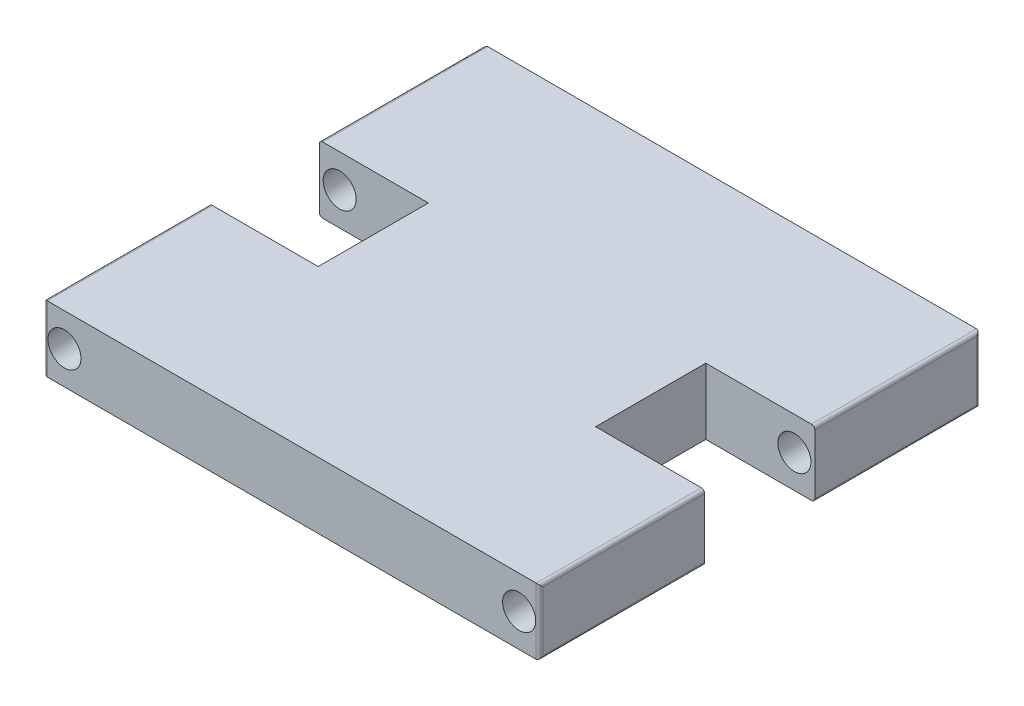
ISO-10303-21;
HEADER;
FILE_DESCRIPTION(('STEP AP214'),'2;1');
FILE_NAME('part.step','',(''),(''),'','','');
FILE_SCHEMA(('AUTOMOTIVE_DESIGN { 1 0 10303 214 1 1 1 1 }'));
ENDSEC;
DATA;
#1=APPLICATION_CONTEXT('core data for automotive mechanical design processes');
#2=APPLICATION_PROTOCOL_DEFINITION('international standard','automotive_design',2000,#1);
#3=PRODUCT_CONTEXT('',#1,'mechanical');
#4=PRODUCT('Part','Part','',(#3));
#5=PRODUCT_RELATED_PRODUCT_CATEGORY('part','',(#4));
#6=PRODUCT_DEFINITION_FORMATION('','',#4);
#7=PRODUCT_DEFINITION_CONTEXT('part definition',#1,'design');
#8=PRODUCT_DEFINITION('design','',#6,#7);
#9=PRODUCT_DEFINITION_SHAPE('','',#8);
#10=(LENGTH_UNIT() NAMED_UNIT(*) SI_UNIT(.MILLI.,.METRE.));
#11=(NAMED_UNIT(*) PLANE_ANGLE_UNIT() SI_UNIT($,.RADIAN.));
#12=(NAMED_UNIT(*) SI_UNIT($,.STERADIAN.) SOLID_ANGLE_UNIT());
#13=UNCERTAINTY_MEASURE_WITH_UNIT(LENGTH_MEASURE(1.E-05),#10,'distance_accuracy_value','');
#14=(GEOMETRIC_REPRESENTATION_CONTEXT(3) GLOBAL_UNCERTAINTY_ASSIGNED_CONTEXT((#13)) GLOBAL_UNIT_ASSIGNED_CONTEXT((#10,
#11,#12)) REPRESENTATION_CONTEXT('',''));
#15=CARTESIAN_POINT('',(0.,0.,0.));
#16=DIRECTION('',(0.,0.,1.));
#17=DIRECTION('',(1.,0.,0.));
#18=AXIS2_PLACEMENT_3D('',#15,#16,#17);
#19=CARTESIAN_POINT('',(0.,60.,-3.00000000000002));
#20=DIRECTION('',(1.,0.,0.));
#21=DIRECTION('',(0.,0.,-1.));
#22=AXIS2_PLACEMENT_3D('',#19,#20,#21);
#23=PLANE('',#22);
#24=DIRECTION('',(0.,1.,0.));
#25=VECTOR('',#24,1.);
#26=CARTESIAN_POINT('',(0.,60.,-150.));
#27=LINE('',#26,#25);
#28=CARTESIAN_POINT('',(0.,3.,-150.));
#29=VERTEX_POINT('',#28);
#30=CARTESIAN_POINT('',(0.,56.9999999999999,-150.));
#31=VERTEX_POINT('',#30);
#32=EDGE_CURVE('E280',#29,#31,#27,.T.);
#33=ORIENTED_EDGE('',*,*,#32,.F.);
#34=DIRECTION('',(0.,0.,1.));
#35=VECTOR('',#34,1.);
#36=CARTESIAN_POINT('',(0.,3.00000000000002,-400.));
#37=LINE('',#36,#35);
#38=CARTESIAN_POINT('',(0.,3.00000000000002,-3.));
#39=VERTEX_POINT('',#38);
#40=EDGE_CURVE('E297',#29,#39,#37,.T.);
#41=ORIENTED_EDGE('',*,*,#40,.T.);
#42=DIRECTION('',(0.,-1.,0.));
#43=VECTOR('',#42,1.);
#44=CARTESIAN_POINT('',(0.,60.,-3.00000000000002));
#45=LINE('',#44,#43);
#46=CARTESIAN_POINT('',(0.,56.9999999999999,-3.));
#47=VERTEX_POINT('',#46);
#48=EDGE_CURVE('E436',#47,#39,#45,.T.);
#49=ORIENTED_EDGE('',*,*,#48,.F.);
#50=DIRECTION('',(0.,0.,1.));
#51=VECTOR('',#50,1.);
#52=CARTESIAN_POINT('',(0.,56.9999999999999,-400.));
#53=LINE('',#52,#51);
#54=EDGE_CURVE('E298',#31,#47,#53,.T.);
#55=ORIENTED_EDGE('',*,*,#54,.F.);
#56=EDGE_LOOP('',(#33,#41,#49,#55));
#57=FACE_BOUND('',#56,.T.);
#58=ADVANCED_FACE('F40',(#57),#23,.F.);
#59=DIRECTION('',(0.,-1.,0.));
#60=VECTOR('',#59,1.);
#61=CARTESIAN_POINT('',(0.,60.,-250.));
#62=LINE('',#61,#60);
#63=CARTESIAN_POINT('',(0.,56.9999999999999,-250.));
#64=VERTEX_POINT('',#63);
#65=CARTESIAN_POINT('',(0.,3.,-250.));
#66=VERTEX_POINT('',#65);
#67=EDGE_CURVE('E266',#64,#66,#62,.T.);
#68=ORIENTED_EDGE('',*,*,#67,.F.);
#69=CARTESIAN_POINT('',(0.,56.9999999999999,-397.));
#70=VERTEX_POINT('',#69);
#71=EDGE_CURVE('E293',#70,#64,#53,.T.);
#72=ORIENTED_EDGE('',*,*,#71,.F.);
#73=DIRECTION('',(0.,-1.,0.));
#74=VECTOR('',#73,1.);
#75=CARTESIAN_POINT('',(0.,60.,-397.));
#76=LINE('',#75,#74);
#77=CARTESIAN_POINT('',(0.,3.00000000000002,-397.));
#78=VERTEX_POINT('',#77);
#79=EDGE_CURVE('E440',#70,#78,#76,.T.);
#80=ORIENTED_EDGE('',*,*,#79,.T.);
#81=EDGE_CURVE('E299',#78,#66,#37,.T.);
#82=ORIENTED_EDGE('',*,*,#81,.T.);
#83=EDGE_LOOP('',(#68,#72,#80,#82));
#84=FACE_BOUND('',#83,.T.);
#85=ADVANCED_FACE('F486',(#84),#23,.F.);
#86=CARTESIAN_POINT('',(450.,60.,-3.));
#87=DIRECTION('',(-1.,0.,0.));
#88=DIRECTION('',(0.,0.,1.));
#89=AXIS2_PLACEMENT_3D('',#86,#87,#88);
#90=PLANE('',#89);
#91=DIRECTION('',(0.,-1.,0.));
#92=VECTOR('',#91,1.);
#93=CARTESIAN_POINT('',(450.,60.,-150.));
#94=LINE('',#93,#92);
#95=CARTESIAN_POINT('',(450.,57.,-150.));
#96=VERTEX_POINT('',#95);
#97=CARTESIAN_POINT('',(450.,3.,-150.));
#98=VERTEX_POINT('',#97);
#99=EDGE_CURVE('E253',#96,#98,#94,.T.);
#100=ORIENTED_EDGE('',*,*,#99,.F.);
#101=DIRECTION('',(0.,0.,1.));
#102=VECTOR('',#101,1.);
#103=CARTESIAN_POINT('',(450.,57.,-400.));
#104=LINE('',#103,#102);
#105=CARTESIAN_POINT('',(450.,57.,-3.));
#106=VERTEX_POINT('',#105);
#107=EDGE_CURVE('E400',#96,#106,#104,.T.);
#108=ORIENTED_EDGE('',*,*,#107,.T.);
#109=DIRECTION('',(0.,-1.,0.));
#110=VECTOR('',#109,1.);
#111=CARTESIAN_POINT('',(450.,60.,-3.));
#112=LINE('',#111,#110);
#113=CARTESIAN_POINT('',(450.,3.,-3.));
#114=VERTEX_POINT('',#113);
#115=EDGE_CURVE('E429',#106,#114,#112,.T.);
#116=ORIENTED_EDGE('',*,*,#115,.T.);
#117=DIRECTION('',(0.,0.,1.));
#118=VECTOR('',#117,1.);
#119=CARTESIAN_POINT('',(450.,3.,-400.));
#120=LINE('',#119,#118);
#121=EDGE_CURVE('E410',#98,#114,#120,.T.);
#122=ORIENTED_EDGE('',*,*,#121,.F.);
#123=EDGE_LOOP('',(#100,#108,#116,#122));
#124=FACE_BOUND('',#123,.T.);
#125=ADVANCED_FACE('F492',(#124),#90,.F.);
#126=DIRECTION('',(0.,1.,0.));
#127=VECTOR('',#126,1.);
#128=CARTESIAN_POINT('',(450.,60.,-250.));
#129=LINE('',#128,#127);
#130=CARTESIAN_POINT('',(450.,3.,-250.));
#131=VERTEX_POINT('',#130);
#132=CARTESIAN_POINT('',(450.,57.,-250.));
#133=VERTEX_POINT('',#132);
#134=EDGE_CURVE('E67',#131,#133,#129,.T.);
#135=ORIENTED_EDGE('',*,*,#134,.F.);
#136=CARTESIAN_POINT('',(450.,3.,-397.));
#137=VERTEX_POINT('',#136);
#138=EDGE_CURVE('E305',#137,#131,#120,.T.);
#139=ORIENTED_EDGE('',*,*,#138,.F.);
#140=DIRECTION('',(0.,-1.,0.));
#141=VECTOR('',#140,1.);
#142=CARTESIAN_POINT('',(450.,60.,-397.));
#143=LINE('',#142,#141);
#144=CARTESIAN_POINT('',(450.,57.,-397.));
#145=VERTEX_POINT('',#144);
#146=EDGE_CURVE('E332',#145,#137,#143,.T.);
#147=ORIENTED_EDGE('',*,*,#146,.F.);
#148=EDGE_CURVE('E397',#145,#133,#104,.T.);
#149=ORIENTED_EDGE('',*,*,#148,.T.);
#150=EDGE_LOOP('',(#135,#139,#147,#149));
#151=FACE_BOUND('',#150,.T.);
#152=ADVANCED_FACE('F547',(#151),#90,.F.);
#153=CARTESIAN_POINT('',(447.,60.,-397.));
#154=DIRECTION('',(0.,-1.,0.));
#155=DIRECTION('',(0.,0.,-1.));
#156=AXIS2_PLACEMENT_3D('',#153,#154,#155);
#157=PLANE('',#156);
#158=DIRECTION('',(1.,0.,0.));
#159=VECTOR('',#158,1.);
#160=CARTESIAN_POINT('',(447.,60.,-150.));
#161=LINE('',#160,#159);
#162=CARTESIAN_POINT('',(3.,59.9999999999999,-150.));
#163=VERTEX_POINT('',#162);
#164=CARTESIAN_POINT('',(99.,60.,-150.));
#165=VERTEX_POINT('',#164);
#166=EDGE_CURVE('E189',#163,#165,#161,.T.);
#167=ORIENTED_EDGE('',*,*,#166,.F.);
#168=DIRECTION('',(0.,0.,1.));
#169=VECTOR('',#168,1.);
#170=CARTESIAN_POINT('',(3.,60.,-400.));
#171=LINE('',#170,#169);
#172=CARTESIAN_POINT('',(3.00000000000001,60.,0.));
#173=VERTEX_POINT('',#172);
#174=EDGE_CURVE('E364',#163,#173,#171,.T.);
#175=ORIENTED_EDGE('',*,*,#174,.T.);
#176=DIRECTION('',(1.,0.,0.));
#177=VECTOR('',#176,1.);
#178=CARTESIAN_POINT('',(447.,60.,0.));
#179=LINE('',#178,#177);
#180=CARTESIAN_POINT('',(447.,60.,0.));
#181=VERTEX_POINT('',#180);
#182=EDGE_CURVE('E328',#173,#181,#179,.T.);
#183=ORIENTED_EDGE('',*,*,#182,.T.);
#184=DIRECTION('',(0.,0.,1.));
#185=VECTOR('',#184,1.);
#186=CARTESIAN_POINT('',(447.,59.9999999999999,-400.));
#187=LINE('',#186,#185);
#188=CARTESIAN_POINT('',(447.,60.,-150.));
#189=VERTEX_POINT('',#188);
#190=EDGE_CURVE('E292',#189,#181,#187,.T.);
#191=ORIENTED_EDGE('',*,*,#190,.F.);
#192=DIRECTION('',(1.,0.,0.));
#193=VECTOR('',#192,1.);
#194=CARTESIAN_POINT('',(447.,60.,-150.));
#195=LINE('',#194,#193);
#196=CARTESIAN_POINT('',(351.,60.,-150.));
#197=VERTEX_POINT('',#196);
#198=EDGE_CURVE('E250',#197,#189,#195,.T.);
#199=ORIENTED_EDGE('',*,*,#198,.F.);
#200=DIRECTION('',(0.,0.,1.));
#201=VECTOR('',#200,1.);
#202=CARTESIAN_POINT('',(351.,60.,-397.));
#203=LINE('',#202,#201);
#204=CARTESIAN_POINT('',(351.,60.,-250.));
#205=VERTEX_POINT('',#204);
#206=EDGE_CURVE('E286',#205,#197,#203,.T.);
#207=ORIENTED_EDGE('',*,*,#206,.F.);
#208=DIRECTION('',(-1.,0.,0.));
#209=VECTOR('',#208,1.);
#210=CARTESIAN_POINT('',(447.,60.,-250.));
#211=LINE('',#210,#209);
#212=CARTESIAN_POINT('',(447.,60.,-250.));
#213=VERTEX_POINT('',#212);
#214=EDGE_CURVE('E236',#213,#205,#211,.T.);
#215=ORIENTED_EDGE('',*,*,#214,.F.);
#216=CARTESIAN_POINT('',(447.,60.,-400.));
#217=VERTEX_POINT('',#216);
#218=EDGE_CURVE('E360',#217,#213,#187,.T.);
#219=ORIENTED_EDGE('',*,*,#218,.F.);
#220=DIRECTION('',(-1.,0.,0.));
#221=VECTOR('',#220,1.);
#222=CARTESIAN_POINT('',(3.,60.,-400.));
#223=LINE('',#222,#221);
#224=CARTESIAN_POINT('',(3.,60.,-400.));
#225=VERTEX_POINT('',#224);
#226=EDGE_CURVE('E333',#217,#225,#223,.T.);
#227=ORIENTED_EDGE('',*,*,#226,.T.);
#228=CARTESIAN_POINT('',(3.,60.,-250.));
#229=VERTEX_POINT('',#228);
#230=EDGE_CURVE('E371',#225,#229,#171,.T.);
#231=ORIENTED_EDGE('',*,*,#230,.T.);
#232=DIRECTION('',(-1.,0.,0.));
#233=VECTOR('',#232,1.);
#234=CARTESIAN_POINT('',(447.,60.,-250.));
#235=LINE('',#234,#233);
#236=CARTESIAN_POINT('',(99.,60.,-250.));
#237=VERTEX_POINT('',#236);
#238=EDGE_CURVE('E59',#237,#229,#235,.T.);
#239=ORIENTED_EDGE('',*,*,#238,.F.);
#240=DIRECTION('',(0.,0.,-1.));
#241=VECTOR('',#240,1.);
#242=CARTESIAN_POINT('',(99.,60.,-397.));
#243=LINE('',#242,#241);
#244=EDGE_CURVE('E289',#165,#237,#243,.T.);
#245=ORIENTED_EDGE('',*,*,#244,.F.);
#246=EDGE_LOOP('',(#167,#175,#183,#191,#199,#207,#215,#219,#227,#231,#239,#245));
#247=FACE_BOUND('',#246,.T.);
#248=ADVANCED_FACE('F527',(#247),#157,.F.);
#249=CARTESIAN_POINT('',(447.,0.,-397.));
#250=DIRECTION('',(0.,-1.,0.));
#251=DIRECTION('',(0.,0.,-1.));
#252=AXIS2_PLACEMENT_3D('',#249,#250,#251);
#253=PLANE('',#252);
#254=DIRECTION('',(0.,0.,1.));
#255=VECTOR('',#254,1.);
#256=CARTESIAN_POINT('',(3.00000000000002,0.,-400.));
#257=LINE('',#256,#255);
#258=CARTESIAN_POINT('',(3.,0.,-150.));
#259=VERTEX_POINT('',#258);
#260=CARTESIAN_POINT('',(3.,0.,1.19999999968419E-05));
#261=VERTEX_POINT('',#260);
#262=EDGE_CURVE('E44',#259,#261,#257,.T.);
#263=ORIENTED_EDGE('',*,*,#262,.F.);
#264=DIRECTION('',(1.,0.,0.));
#265=VECTOR('',#264,1.);
#266=CARTESIAN_POINT('',(-0.999999999999969,0.,-150.));
#267=LINE('',#266,#265);
#268=CARTESIAN_POINT('',(99.,0.,-150.));
#269=VERTEX_POINT('',#268);
#270=EDGE_CURVE('E186',#259,#269,#267,.T.);
#271=ORIENTED_EDGE('',*,*,#270,.T.);
#272=DIRECTION('',(0.,0.,-1.));
#273=VECTOR('',#272,1.);
#274=CARTESIAN_POINT('',(99.,0.,-250.));
#275=LINE('',#274,#273);
#276=CARTESIAN_POINT('',(99.,0.,-250.));
#277=VERTEX_POINT('',#276);
#278=EDGE_CURVE('E197',#269,#277,#275,.T.);
#279=ORIENTED_EDGE('',*,*,#278,.T.);
#280=DIRECTION('',(-1.,0.,0.));
#281=VECTOR('',#280,1.);
#282=CARTESIAN_POINT('',(-0.999999999999981,0.,-250.));
#283=LINE('',#282,#281);
#284=CARTESIAN_POINT('',(3.,0.,-250.));
#285=VERTEX_POINT('',#284);
#286=EDGE_CURVE('E203',#277,#285,#283,.T.);
#287=ORIENTED_EDGE('',*,*,#286,.T.);
#288=CARTESIAN_POINT('',(3.,0.,-400.));
#289=VERTEX_POINT('',#288);
#290=EDGE_CURVE('E315',#289,#285,#257,.T.);
#291=ORIENTED_EDGE('',*,*,#290,.F.);
#292=DIRECTION('',(-1.,0.,0.));
#293=VECTOR('',#292,1.);
#294=CARTESIAN_POINT('',(3.,0.,-400.));
#295=LINE('',#294,#293);
#296=CARTESIAN_POINT('',(447.,0.,-400.));
#297=VERTEX_POINT('',#296);
#298=EDGE_CURVE('E340',#297,#289,#295,.T.);
#299=ORIENTED_EDGE('',*,*,#298,.F.);
#300=DIRECTION('',(0.,0.,1.));
#301=VECTOR('',#300,1.);
#302=CARTESIAN_POINT('',(447.,0.,-400.));
#303=LINE('',#302,#301);
#304=CARTESIAN_POINT('',(447.,0.,-250.));
#305=VERTEX_POINT('',#304);
#306=EDGE_CURVE('E309',#297,#305,#303,.T.);
#307=ORIENTED_EDGE('',*,*,#306,.T.);
#308=DIRECTION('',(-1.,0.,0.));
#309=VECTOR('',#308,1.);
#310=CARTESIAN_POINT('',(351.,0.,-250.));
#311=LINE('',#310,#309);
#312=CARTESIAN_POINT('',(351.,0.,-250.));
#313=VERTEX_POINT('',#312);
#314=EDGE_CURVE('E227',#305,#313,#311,.T.);
#315=ORIENTED_EDGE('',*,*,#314,.T.);
#316=DIRECTION('',(0.,0.,1.));
#317=VECTOR('',#316,1.);
#318=CARTESIAN_POINT('',(351.,0.,-250.));
#319=LINE('',#318,#317);
#320=CARTESIAN_POINT('',(351.,0.,-150.));
#321=VERTEX_POINT('',#320);
#322=EDGE_CURVE('E219',#313,#321,#319,.T.);
#323=ORIENTED_EDGE('',*,*,#322,.T.);
#324=DIRECTION('',(1.,0.,0.));
#325=VECTOR('',#324,1.);
#326=CARTESIAN_POINT('',(351.,0.,-150.));
#327=LINE('',#326,#325);
#328=CARTESIAN_POINT('',(447.,0.,-150.));
#329=VERTEX_POINT('',#328);
#330=EDGE_CURVE('E223',#321,#329,#327,.T.);
#331=ORIENTED_EDGE('',*,*,#330,.T.);
#332=CARTESIAN_POINT('',(447.,0.,0.));
#333=VERTEX_POINT('',#332);
#334=EDGE_CURVE('E312',#329,#333,#303,.T.);
#335=ORIENTED_EDGE('',*,*,#334,.T.);
#336=DIRECTION('',(1.,0.,0.));
#337=VECTOR('',#336,1.);
#338=CARTESIAN_POINT('',(3.00000000000002,0.,0.));
#339=LINE('',#338,#337);
#340=EDGE_CURVE('E336',#261,#333,#339,.T.);
#341=ORIENTED_EDGE('',*,*,#340,.F.);
#342=EDGE_LOOP('',(#263,#271,#279,#287,#291,#299,#307,#315,#323,#331,#335,#341));
#343=FACE_BOUND('',#342,.T.);
#344=ADVANCED_FACE('F206',(#343),#253,.T.);
#345=CARTESIAN_POINT('',(3.,3.,-400.));
#346=DIRECTION('',(0.,0.,1.));
#347=DIRECTION('',(1.,0.,0.));
#348=AXIS2_PLACEMENT_3D('',#345,#346,#347);
#349=CYLINDRICAL_SURFACE('',#348,3.);
#350=ORIENTED_EDGE('',*,*,#40,.F.);
#351=CARTESIAN_POINT('',(3.,3.,-150.));
#352=DIRECTION('',(0.,0.,-1.));
#353=DIRECTION('',(-1.,0.,0.));
#354=AXIS2_PLACEMENT_3D('',#351,#352,#353);
#355=CIRCLE('',#354,3.);
#356=EDGE_CURVE('E283',#29,#259,#355,.F.);
#357=ORIENTED_EDGE('',*,*,#356,.T.);
#358=ORIENTED_EDGE('',*,*,#262,.T.);
#359=CARTESIAN_POINT('',(3.,3.,-3.));
#360=DIRECTION('',(0.,-0.707106781186547,-0.707106781186547));
#361=DIRECTION('',(0.,-0.707106781186547,0.707106781186547));
#362=AXIS2_PLACEMENT_3D('',#359,#360,#361);
#363=ELLIPSE('',#362,4.24264068711928,3.);
#364=EDGE_CURVE('E379',#261,#39,#363,.T.);
#365=ORIENTED_EDGE('',*,*,#364,.T.);
#366=EDGE_LOOP('',(#350,#357,#358,#365));
#367=FACE_BOUND('',#366,.T.);
#368=ADVANCED_FACE('F481',(#367),#349,.T.);
#369=ORIENTED_EDGE('',*,*,#290,.T.);
#370=CARTESIAN_POINT('',(3.,3.,-250.));
#371=DIRECTION('',(0.,0.,1.));
#372=DIRECTION('',(1.,0.,0.));
#373=AXIS2_PLACEMENT_3D('',#370,#371,#372);
#374=CIRCLE('',#373,3.);
#375=EDGE_CURVE('E269',#285,#66,#374,.F.);
#376=ORIENTED_EDGE('',*,*,#375,.T.);
#377=ORIENTED_EDGE('',*,*,#81,.F.);
#378=CARTESIAN_POINT('',(3.,3.,-397.));
#379=DIRECTION('',(0.,-0.707106781186547,0.707106781186547));
#380=DIRECTION('',(0.,-0.707106781186547,-0.707106781186547));
#381=AXIS2_PLACEMENT_3D('',#378,#379,#380);
#382=ELLIPSE('',#381,4.24264068711929,3.);
#383=EDGE_CURVE('E350',#78,#289,#382,.T.);
#384=ORIENTED_EDGE('',*,*,#383,.T.);
#385=EDGE_LOOP('',(#369,#376,#377,#384));
#386=FACE_BOUND('',#385,.T.);
#387=ADVANCED_FACE('F474',(#386),#349,.T.);
#388=CARTESIAN_POINT('',(447.,3.,-400.));
#389=DIRECTION('',(0.,0.,1.));
#390=DIRECTION('',(1.,0.,0.));
#391=AXIS2_PLACEMENT_3D('',#388,#389,#390);
#392=CYLINDRICAL_SURFACE('',#391,2.99999999999998);
#393=ORIENTED_EDGE('',*,*,#334,.F.);
#394=CARTESIAN_POINT('',(447.,3.,-150.));
#395=DIRECTION('',(0.,0.,-1.));
#396=DIRECTION('',(-1.,0.,0.));
#397=AXIS2_PLACEMENT_3D('',#394,#395,#396);
#398=CIRCLE('',#397,2.99999999999998);
#399=EDGE_CURVE('E256',#329,#98,#398,.F.);
#400=ORIENTED_EDGE('',*,*,#399,.T.);
#401=ORIENTED_EDGE('',*,*,#121,.T.);
#402=CARTESIAN_POINT('',(447.,3.,-3.));
#403=DIRECTION('',(0.,-0.707106781186547,-0.707106781186547));
#404=DIRECTION('',(0.,-0.707106781186547,0.707106781186547));
#405=AXIS2_PLACEMENT_3D('',#402,#403,#404);
#406=ELLIPSE('',#405,4.24264068711927,2.99999999999999);
#407=EDGE_CURVE('E345',#114,#333,#406,.T.);
#408=ORIENTED_EDGE('',*,*,#407,.T.);
#409=EDGE_LOOP('',(#393,#400,#401,#408));
#410=FACE_BOUND('',#409,.T.);
#411=ADVANCED_FACE('F472',(#410),#392,.T.);
#412=ORIENTED_EDGE('',*,*,#138,.T.);
#413=CARTESIAN_POINT('',(447.,3.,-250.));
#414=DIRECTION('',(0.,0.,1.));
#415=DIRECTION('',(1.,0.,0.));
#416=AXIS2_PLACEMENT_3D('',#413,#414,#415);
#417=CIRCLE('',#416,2.99999999999998);
#418=EDGE_CURVE('E241',#131,#305,#417,.F.);
#419=ORIENTED_EDGE('',*,*,#418,.T.);
#420=ORIENTED_EDGE('',*,*,#306,.F.);
#421=CARTESIAN_POINT('',(447.,3.,-397.));
#422=DIRECTION('',(0.,-0.707106781186547,0.707106781186547));
#423=DIRECTION('',(0.,-0.707106781186547,-0.707106781186547));
#424=AXIS2_PLACEMENT_3D('',#421,#422,#423);
#425=ELLIPSE('',#424,4.24264068711927,2.99999999999999);
#426=EDGE_CURVE('E349',#297,#137,#425,.T.);
#427=ORIENTED_EDGE('',*,*,#426,.T.);
#428=EDGE_LOOP('',(#412,#419,#420,#427));
#429=FACE_BOUND('',#428,.T.);
#430=ADVANCED_FACE('F423',(#429),#392,.T.);
#431=CARTESIAN_POINT('',(3.,56.9999999999999,-400.));
#432=DIRECTION('',(0.,0.,1.));
#433=DIRECTION('',(1.,0.,0.));
#434=AXIS2_PLACEMENT_3D('',#431,#432,#433);
#435=CYLINDRICAL_SURFACE('',#434,2.99999999999999);
#436=ORIENTED_EDGE('',*,*,#174,.F.);
#437=CARTESIAN_POINT('',(3.,56.9999999999999,-150.));
#438=DIRECTION('',(0.,0.,-1.));
#439=DIRECTION('',(-1.,0.,0.));
#440=AXIS2_PLACEMENT_3D('',#437,#438,#439);
#441=CIRCLE('',#440,2.99999999999999);
#442=EDGE_CURVE('E274',#163,#31,#441,.F.);
#443=ORIENTED_EDGE('',*,*,#442,.T.);
#444=ORIENTED_EDGE('',*,*,#54,.T.);
#445=CARTESIAN_POINT('',(3.,56.9999999999999,-3.));
#446=DIRECTION('',(0.,-0.707106781186547,0.707106781186547));
#447=DIRECTION('',(0.,-0.707106781186547,-0.707106781186547));
#448=AXIS2_PLACEMENT_3D('',#445,#446,#447);
#449=ELLIPSE('',#448,4.24264068711928,3.);
#450=EDGE_CURVE('E367',#47,#173,#449,.F.);
#451=ORIENTED_EDGE('',*,*,#450,.T.);
#452=EDGE_LOOP('',(#436,#443,#444,#451));
#453=FACE_BOUND('',#452,.T.);
#454=ADVANCED_FACE('F480',(#453),#435,.T.);
#455=ORIENTED_EDGE('',*,*,#71,.T.);
#456=CARTESIAN_POINT('',(3.,56.9999999999999,-250.));
#457=DIRECTION('',(0.,0.,1.));
#458=DIRECTION('',(1.,0.,0.));
#459=AXIS2_PLACEMENT_3D('',#456,#457,#458);
#460=CIRCLE('',#459,2.99999999999999);
#461=EDGE_CURVE('E261',#64,#229,#460,.F.);
#462=ORIENTED_EDGE('',*,*,#461,.T.);
#463=ORIENTED_EDGE('',*,*,#230,.F.);
#464=CARTESIAN_POINT('',(3.,56.9999999999999,-397.));
#465=DIRECTION('',(0.,-0.707106781186547,-0.707106781186547));
#466=DIRECTION('',(0.,-0.707106781186547,0.707106781186547));
#467=AXIS2_PLACEMENT_3D('',#464,#465,#466);
#468=ELLIPSE('',#467,4.24264068711928,3.);
#469=EDGE_CURVE('E359',#225,#70,#468,.F.);
#470=ORIENTED_EDGE('',*,*,#469,.T.);
#471=EDGE_LOOP('',(#455,#462,#463,#470));
#472=FACE_BOUND('',#471,.T.);
#473=ADVANCED_FACE('F569',(#472),#435,.T.);
#474=CARTESIAN_POINT('',(447.,57.,-400.));
#475=DIRECTION('',(0.,0.,1.));
#476=DIRECTION('',(1.,0.,0.));
#477=AXIS2_PLACEMENT_3D('',#474,#475,#476);
#478=CYLINDRICAL_SURFACE('',#477,2.99999999999998);
#479=ORIENTED_EDGE('',*,*,#107,.F.);
#480=CARTESIAN_POINT('',(447.,57.,-150.));
#481=DIRECTION('',(0.,0.,-1.));
#482=DIRECTION('',(-1.,0.,0.));
#483=AXIS2_PLACEMENT_3D('',#480,#481,#482);
#484=CIRCLE('',#483,2.99999999999998);
#485=EDGE_CURVE('E246',#96,#189,#484,.F.);
#486=ORIENTED_EDGE('',*,*,#485,.T.);
#487=ORIENTED_EDGE('',*,*,#190,.T.);
#488=CARTESIAN_POINT('',(447.,57.,-3.));
#489=DIRECTION('',(0.,-0.707106781186547,0.707106781186547));
#490=DIRECTION('',(0.,-0.707106781186547,-0.707106781186547));
#491=AXIS2_PLACEMENT_3D('',#488,#489,#490);
#492=ELLIPSE('',#491,4.24264068711927,2.99999999999999);
#493=EDGE_CURVE('E355',#181,#106,#492,.F.);
#494=ORIENTED_EDGE('',*,*,#493,.T.);
#495=EDGE_LOOP('',(#479,#486,#487,#494));
#496=FACE_BOUND('',#495,.T.);
#497=ADVANCED_FACE('F545',(#496),#478,.T.);
#498=ORIENTED_EDGE('',*,*,#218,.T.);
#499=CARTESIAN_POINT('',(447.,57.,-250.));
#500=DIRECTION('',(0.,0.,1.));
#501=DIRECTION('',(1.,0.,0.));
#502=AXIS2_PLACEMENT_3D('',#499,#500,#501);
#503=CIRCLE('',#502,2.99999999999998);
#504=EDGE_CURVE('E233',#213,#133,#503,.F.);
#505=ORIENTED_EDGE('',*,*,#504,.T.);
#506=ORIENTED_EDGE('',*,*,#148,.F.);
#507=CARTESIAN_POINT('',(447.,57.,-397.));
#508=DIRECTION('',(0.,-0.707106781186547,-0.707106781186547));
#509=DIRECTION('',(0.,-0.707106781186547,0.707106781186547));
#510=AXIS2_PLACEMENT_3D('',#507,#508,#509);
#511=ELLIPSE('',#510,4.24264068711927,2.99999999999999);
#512=EDGE_CURVE('E351',#145,#217,#511,.F.);
#513=ORIENTED_EDGE('',*,*,#512,.T.);
#514=EDGE_LOOP('',(#498,#505,#506,#513));
#515=FACE_BOUND('',#514,.T.);
#516=ADVANCED_FACE('F532',(#515),#478,.T.);
#517=CARTESIAN_POINT('',(18.5,30.,-400.));
#518=DIRECTION('',(0.,0.,1.));
#519=DIRECTION('',(1.,0.,0.));
#520=AXIS2_PLACEMENT_3D('',#517,#518,#519);
#521=CYLINDRICAL_SURFACE('',#520,15.);
#522=CARTESIAN_POINT('',(18.5,30.,0.));
#523=DIRECTION('',(0.,0.,-1.));
#524=DIRECTION('',(-1.,0.,0.));
#525=AXIS2_PLACEMENT_3D('',#522,#523,#524);
#526=CIRCLE('',#525,15.);
#527=CARTESIAN_POINT('',(3.50000000000005,30.,0.));
#528=VERTEX_POINT('',#527);
#529=EDGE_CURVE('E354',#528,#528,#526,.T.);
#530=ORIENTED_EDGE('',*,*,#529,.F.);
#531=EDGE_LOOP('',(#530));
#532=FACE_BOUND('',#531,.T.);
#533=CARTESIAN_POINT('',(18.5,30.,-150.));
#534=DIRECTION('',(0.,0.,-1.));
#535=DIRECTION('',(-1.,0.,0.));
#536=AXIS2_PLACEMENT_3D('',#533,#534,#535);
#537=CIRCLE('',#536,15.);
#538=CARTESIAN_POINT('',(3.50000000000005,30.,-150.));
#539=VERTEX_POINT('',#538);
#540=EDGE_CURVE('E273',#539,#539,#537,.F.);
#541=ORIENTED_EDGE('',*,*,#540,.F.);
#542=EDGE_LOOP('',(#541));
#543=FACE_BOUND('',#542,.T.);
#544=ADVANCED_FACE('F557',(#532,#543),#521,.F.);
#545=CARTESIAN_POINT('',(18.5,30.,-400.));
#546=DIRECTION('',(0.,0.,1.));
#547=DIRECTION('',(1.,0.,0.));
#548=AXIS2_PLACEMENT_3D('',#545,#546,#547);
#549=CIRCLE('',#548,15.);
#550=CARTESIAN_POINT('',(33.5,30.,-400.));
#551=VERTEX_POINT('',#550);
#552=EDGE_CURVE('E384',#551,#551,#549,.T.);
#553=ORIENTED_EDGE('',*,*,#552,.F.);
#554=EDGE_LOOP('',(#553));
#555=FACE_BOUND('',#554,.T.);
#556=CARTESIAN_POINT('',(18.5,30.,-250.));
#557=DIRECTION('',(0.,0.,1.));
#558=DIRECTION('',(1.,0.,0.));
#559=AXIS2_PLACEMENT_3D('',#556,#557,#558);
#560=CIRCLE('',#559,15.);
#561=CARTESIAN_POINT('',(33.5,30.,-250.));
#562=VERTEX_POINT('',#561);
#563=EDGE_CURVE('E260',#562,#562,#560,.F.);
#564=ORIENTED_EDGE('',*,*,#563,.F.);
#565=EDGE_LOOP('',(#564));
#566=FACE_BOUND('',#565,.T.);
#567=ADVANCED_FACE('F560',(#555,#566),#521,.F.);
#568=CARTESIAN_POINT('',(431.5,30.,-400.));
#569=DIRECTION('',(0.,0.,1.));
#570=DIRECTION('',(1.,0.,0.));
#571=AXIS2_PLACEMENT_3D('',#568,#569,#570);
#572=CYLINDRICAL_SURFACE('',#571,15.);
#573=CARTESIAN_POINT('',(431.5,30.,0.));
#574=DIRECTION('',(0.,0.,-1.));
#575=DIRECTION('',(-1.,0.,0.));
#576=AXIS2_PLACEMENT_3D('',#573,#574,#575);
#577=CIRCLE('',#576,15.);
#578=CARTESIAN_POINT('',(416.5,30.,0.));
#579=VERTEX_POINT('',#578);
#580=EDGE_CURVE('E451',#579,#579,#577,.T.);
#581=ORIENTED_EDGE('',*,*,#580,.F.);
#582=EDGE_LOOP('',(#581));
#583=FACE_BOUND('',#582,.T.);
#584=CARTESIAN_POINT('',(431.5,30.,-150.));
#585=DIRECTION('',(0.,0.,-1.));
#586=DIRECTION('',(-1.,0.,0.));
#587=AXIS2_PLACEMENT_3D('',#584,#585,#586);
#588=CIRCLE('',#587,15.);
#589=CARTESIAN_POINT('',(416.5,30.,-150.));
#590=VERTEX_POINT('',#589);
#591=EDGE_CURVE('E245',#590,#590,#588,.F.);
#592=ORIENTED_EDGE('',*,*,#591,.F.);
#593=EDGE_LOOP('',(#592));
#594=FACE_BOUND('',#593,.T.);
#595=ADVANCED_FACE('F562',(#583,#594),#572,.F.);
#596=CARTESIAN_POINT('',(431.5,30.,-400.));
#597=DIRECTION('',(0.,0.,1.));
#598=DIRECTION('',(1.,0.,0.));
#599=AXIS2_PLACEMENT_3D('',#596,#597,#598);
#600=CIRCLE('',#599,15.);
#601=CARTESIAN_POINT('',(446.5,30.,-400.));
#602=VERTEX_POINT('',#601);
#603=EDGE_CURVE('E394',#602,#602,#600,.T.);
#604=ORIENTED_EDGE('',*,*,#603,.F.);
#605=EDGE_LOOP('',(#604));
#606=FACE_BOUND('',#605,.T.);
#607=CARTESIAN_POINT('',(431.5,30.,-250.));
#608=DIRECTION('',(0.,0.,1.));
#609=DIRECTION('',(1.,0.,0.));
#610=AXIS2_PLACEMENT_3D('',#607,#608,#609);
#611=CIRCLE('',#610,15.);
#612=CARTESIAN_POINT('',(446.5,30.,-250.));
#613=VERTEX_POINT('',#612);
#614=EDGE_CURVE('E193',#613,#613,#611,.F.);
#615=ORIENTED_EDGE('',*,*,#614,.F.);
#616=EDGE_LOOP('',(#615));
#617=FACE_BOUND('',#616,.T.);
#618=ADVANCED_FACE('F565',(#606,#617),#572,.F.);
#619=CARTESIAN_POINT('',(447.,60.,-397.));
#620=DIRECTION('',(0.,-1.,0.));
#621=DIRECTION('',(0.,0.,-1.));
#622=AXIS2_PLACEMENT_3D('',#619,#620,#621);
#623=CYLINDRICAL_SURFACE('',#622,3.);
#624=ORIENTED_EDGE('',*,*,#512,.F.);
#625=ORIENTED_EDGE('',*,*,#146,.T.);
#626=ORIENTED_EDGE('',*,*,#426,.F.);
#627=DIRECTION('',(0.,-1.,0.));
#628=VECTOR('',#627,1.);
#629=CARTESIAN_POINT('',(447.,60.,-400.));
#630=LINE('',#629,#628);
#631=EDGE_CURVE('E12',#217,#297,#630,.T.);
#632=ORIENTED_EDGE('',*,*,#631,.F.);
#633=EDGE_LOOP('',(#624,#625,#626,#632));
#634=FACE_BOUND('',#633,.T.);
#635=ADVANCED_FACE('F42',(#634),#623,.T.);
#636=CARTESIAN_POINT('',(3.,60.,-397.));
#637=DIRECTION('',(0.,-1.,0.));
#638=DIRECTION('',(0.,0.,-1.));
#639=AXIS2_PLACEMENT_3D('',#636,#637,#638);
#640=CYLINDRICAL_SURFACE('',#639,3.);
#641=ORIENTED_EDGE('',*,*,#383,.F.);
#642=ORIENTED_EDGE('',*,*,#79,.F.);
#643=ORIENTED_EDGE('',*,*,#469,.F.);
#644=DIRECTION('',(0.,-1.,0.));
#645=VECTOR('',#644,1.);
#646=CARTESIAN_POINT('',(3.,60.,-400.));
#647=LINE('',#646,#645);
#648=EDGE_CURVE('E51',#225,#289,#647,.T.);
#649=ORIENTED_EDGE('',*,*,#648,.T.);
#650=EDGE_LOOP('',(#641,#642,#643,#649));
#651=FACE_BOUND('',#650,.T.);
#652=ADVANCED_FACE('F499',(#651),#640,.T.);
#653=CARTESIAN_POINT('',(3.,60.,-3.));
#654=DIRECTION('',(0.,-1.,0.));
#655=DIRECTION('',(0.,0.,-1.));
#656=AXIS2_PLACEMENT_3D('',#653,#654,#655);
#657=CYLINDRICAL_SURFACE('',#656,3.);
#658=ORIENTED_EDGE('',*,*,#364,.F.);
#659=DIRECTION('',(0.,-1.,0.));
#660=VECTOR('',#659,1.);
#661=CARTESIAN_POINT('',(3.00000000000002,60.,0.));
#662=LINE('',#661,#660);
#663=EDGE_CURVE('E441',#173,#261,#662,.T.);
#664=ORIENTED_EDGE('',*,*,#663,.F.);
#665=ORIENTED_EDGE('',*,*,#450,.F.);
#666=ORIENTED_EDGE('',*,*,#48,.T.);
#667=EDGE_LOOP('',(#658,#664,#665,#666));
#668=FACE_BOUND('',#667,.T.);
#669=ADVANCED_FACE('F497',(#668),#657,.T.);
#670=CARTESIAN_POINT('',(447.,60.,-3.));
#671=DIRECTION('',(0.,-1.,0.));
#672=DIRECTION('',(0.,0.,-1.));
#673=AXIS2_PLACEMENT_3D('',#670,#671,#672);
#674=CYLINDRICAL_SURFACE('',#673,3.);
#675=ORIENTED_EDGE('',*,*,#493,.F.);
#676=DIRECTION('',(0.,-1.,0.));
#677=VECTOR('',#676,1.);
#678=CARTESIAN_POINT('',(447.,60.,0.));
#679=LINE('',#678,#677);
#680=EDGE_CURVE('E432',#181,#333,#679,.T.);
#681=ORIENTED_EDGE('',*,*,#680,.T.);
#682=ORIENTED_EDGE('',*,*,#407,.F.);
#683=ORIENTED_EDGE('',*,*,#115,.F.);
#684=EDGE_LOOP('',(#675,#681,#682,#683));
#685=FACE_BOUND('',#684,.T.);
#686=ADVANCED_FACE('F464',(#685),#674,.T.);
#687=CARTESIAN_POINT('',(3.,60.,-400.));
#688=DIRECTION('',(0.,0.,1.));
#689=DIRECTION('',(1.,0.,0.));
#690=AXIS2_PLACEMENT_3D('',#687,#688,#689);
#691=PLANE('',#690);
#692=ORIENTED_EDGE('',*,*,#603,.T.);
#693=EDGE_LOOP('',(#692));
#694=FACE_BOUND('',#693,.T.);
#695=ORIENTED_EDGE('',*,*,#552,.T.);
#696=EDGE_LOOP('',(#695));
#697=FACE_BOUND('',#696,.T.);
#698=ORIENTED_EDGE('',*,*,#298,.T.);
#699=ORIENTED_EDGE('',*,*,#648,.F.);
#700=ORIENTED_EDGE('',*,*,#226,.F.);
#701=ORIENTED_EDGE('',*,*,#631,.T.);
#702=EDGE_LOOP('',(#698,#699,#700,#701));
#703=FACE_BOUND('',#702,.T.);
#704=ADVANCED_FACE('F502',(#694,#697,#703),#691,.F.);
#705=CARTESIAN_POINT('',(3.00000000000002,60.,0.));
#706=DIRECTION('',(0.,0.,-1.));
#707=DIRECTION('',(-1.,0.,0.));
#708=AXIS2_PLACEMENT_3D('',#705,#706,#707);
#709=PLANE('',#708);
#710=ORIENTED_EDGE('',*,*,#580,.T.);
#711=EDGE_LOOP('',(#710));
#712=FACE_BOUND('',#711,.T.);
#713=ORIENTED_EDGE('',*,*,#529,.T.);
#714=EDGE_LOOP('',(#713));
#715=FACE_BOUND('',#714,.T.);
#716=ORIENTED_EDGE('',*,*,#340,.T.);
#717=ORIENTED_EDGE('',*,*,#680,.F.);
#718=ORIENTED_EDGE('',*,*,#182,.F.);
#719=ORIENTED_EDGE('',*,*,#663,.T.);
#720=EDGE_LOOP('',(#716,#717,#718,#719));
#721=FACE_BOUND('',#720,.T.);
#722=ADVANCED_FACE('F468',(#712,#715,#721),#709,.F.);
#723=CARTESIAN_POINT('',(351.,60.000025,-250.));
#724=DIRECTION('',(1.,0.,0.));
#725=DIRECTION('',(0.,0.,-1.));
#726=AXIS2_PLACEMENT_3D('',#723,#724,#725);
#727=PLANE('',#726);
#728=ORIENTED_EDGE('',*,*,#206,.T.);
#729=DIRECTION('',(0.,-1.,0.));
#730=VECTOR('',#729,1.);
#731=CARTESIAN_POINT('',(351.,60.000025,-150.));
#732=LINE('',#731,#730);
#733=EDGE_CURVE('E209',#197,#321,#732,.T.);
#734=ORIENTED_EDGE('',*,*,#733,.T.);
#735=ORIENTED_EDGE('',*,*,#322,.F.);
#736=DIRECTION('',(0.,-1.,0.));
#737=VECTOR('',#736,1.);
#738=CARTESIAN_POINT('',(351.,60.000025,-250.));
#739=LINE('',#738,#737);
#740=EDGE_CURVE('E212',#205,#313,#739,.T.);
#741=ORIENTED_EDGE('',*,*,#740,.F.);
#742=EDGE_LOOP('',(#728,#734,#735,#741));
#743=FACE_BOUND('',#742,.T.);
#744=ADVANCED_FACE('F509',(#743),#727,.T.);
#745=CARTESIAN_POINT('',(351.,60.000025,-150.));
#746=DIRECTION('',(0.,0.,-1.));
#747=DIRECTION('',(-1.,0.,0.));
#748=AXIS2_PLACEMENT_3D('',#745,#746,#747);
#749=PLANE('',#748);
#750=ORIENTED_EDGE('',*,*,#330,.F.);
#751=ORIENTED_EDGE('',*,*,#733,.F.);
#752=ORIENTED_EDGE('',*,*,#198,.T.);
#753=ORIENTED_EDGE('',*,*,#485,.F.);
#754=ORIENTED_EDGE('',*,*,#99,.T.);
#755=ORIENTED_EDGE('',*,*,#399,.F.);
#756=EDGE_LOOP('',(#750,#751,#752,#753,#754,#755));
#757=FACE_BOUND('',#756,.T.);
#758=ORIENTED_EDGE('',*,*,#591,.T.);
#759=EDGE_LOOP('',(#758));
#760=FACE_BOUND('',#759,.T.);
#761=ADVANCED_FACE('F542',(#757,#760),#749,.T.);
#762=CARTESIAN_POINT('',(351.,60.000025,-250.));
#763=DIRECTION('',(0.,0.,1.));
#764=DIRECTION('',(1.,0.,0.));
#765=AXIS2_PLACEMENT_3D('',#762,#763,#764);
#766=PLANE('',#765);
#767=ORIENTED_EDGE('',*,*,#134,.T.);
#768=ORIENTED_EDGE('',*,*,#504,.F.);
#769=ORIENTED_EDGE('',*,*,#214,.T.);
#770=ORIENTED_EDGE('',*,*,#740,.T.);
#771=ORIENTED_EDGE('',*,*,#314,.F.);
#772=ORIENTED_EDGE('',*,*,#418,.F.);
#773=EDGE_LOOP('',(#767,#768,#769,#770,#771,#772));
#774=FACE_BOUND('',#773,.T.);
#775=ORIENTED_EDGE('',*,*,#614,.T.);
#776=EDGE_LOOP('',(#775));
#777=FACE_BOUND('',#776,.T.);
#778=ADVANCED_FACE('F533',(#774,#777),#766,.T.);
#779=CARTESIAN_POINT('',(99.,60.000025,-250.));
#780=DIRECTION('',(-1.,0.,0.));
#781=DIRECTION('',(0.,0.,1.));
#782=AXIS2_PLACEMENT_3D('',#779,#780,#781);
#783=PLANE('',#782);
#784=ORIENTED_EDGE('',*,*,#244,.T.);
#785=DIRECTION('',(0.,-1.,0.));
#786=VECTOR('',#785,1.);
#787=CARTESIAN_POINT('',(99.,60.000025,-250.));
#788=LINE('',#787,#786);
#789=EDGE_CURVE('E194',#237,#277,#788,.T.);
#790=ORIENTED_EDGE('',*,*,#789,.T.);
#791=ORIENTED_EDGE('',*,*,#278,.F.);
#792=DIRECTION('',(0.,-1.,0.));
#793=VECTOR('',#792,1.);
#794=CARTESIAN_POINT('',(99.,60.000025,-150.));
#795=LINE('',#794,#793);
#796=EDGE_CURVE('E181',#165,#269,#795,.T.);
#797=ORIENTED_EDGE('',*,*,#796,.F.);
#798=EDGE_LOOP('',(#784,#790,#791,#797));
#799=FACE_BOUND('',#798,.T.);
#800=ADVANCED_FACE('F198',(#799),#783,.T.);
#801=CARTESIAN_POINT('',(-0.999999999999969,60.000025,-150.));
#802=DIRECTION('',(0.,0.,-1.));
#803=DIRECTION('',(-1.,0.,0.));
#804=AXIS2_PLACEMENT_3D('',#801,#802,#803);
#805=PLANE('',#804);
#806=ORIENTED_EDGE('',*,*,#32,.T.);
#807=ORIENTED_EDGE('',*,*,#442,.F.);
#808=ORIENTED_EDGE('',*,*,#166,.T.);
#809=ORIENTED_EDGE('',*,*,#796,.T.);
#810=ORIENTED_EDGE('',*,*,#270,.F.);
#811=ORIENTED_EDGE('',*,*,#356,.F.);
#812=EDGE_LOOP('',(#806,#807,#808,#809,#810,#811));
#813=FACE_BOUND('',#812,.T.);
#814=ORIENTED_EDGE('',*,*,#540,.T.);
#815=EDGE_LOOP('',(#814));
#816=FACE_BOUND('',#815,.T.);
#817=ADVANCED_FACE('F183',(#813,#816),#805,.T.);
#818=CARTESIAN_POINT('',(-0.999999999999981,60.000025,-250.));
#819=DIRECTION('',(0.,0.,1.));
#820=DIRECTION('',(1.,0.,0.));
#821=AXIS2_PLACEMENT_3D('',#818,#819,#820);
#822=PLANE('',#821);
#823=ORIENTED_EDGE('',*,*,#286,.F.);
#824=ORIENTED_EDGE('',*,*,#789,.F.);
#825=ORIENTED_EDGE('',*,*,#238,.T.);
#826=ORIENTED_EDGE('',*,*,#461,.F.);
#827=ORIENTED_EDGE('',*,*,#67,.T.);
#828=ORIENTED_EDGE('',*,*,#375,.F.);
#829=EDGE_LOOP('',(#823,#824,#825,#826,#827,#828));
#830=FACE_BOUND('',#829,.T.);
#831=ORIENTED_EDGE('',*,*,#563,.T.);
#832=EDGE_LOOP('',(#831));
#833=FACE_BOUND('',#832,.T.);
#834=ADVANCED_FACE('F755',(#830,#833),#822,.T.);
#835=CLOSED_SHELL('',(#58,#85,#125,#152,#248,#344,#368,#387,#411,#430,#454,#473,#497,#516,#544,
#567,#595,#618,#635,#652,#669,#686,#704,#722,#744,#761,#778,#800,#817,#834));
#836=MANIFOLD_SOLID_BREP('B2',#835);
#837=ADVANCED_BREP_SHAPE_REPRESENTATION('',(#18,#836),#14);
#838=SHAPE_DEFINITION_REPRESENTATION(#9,#837);
ENDSEC;
END-ISO-10303-21;
